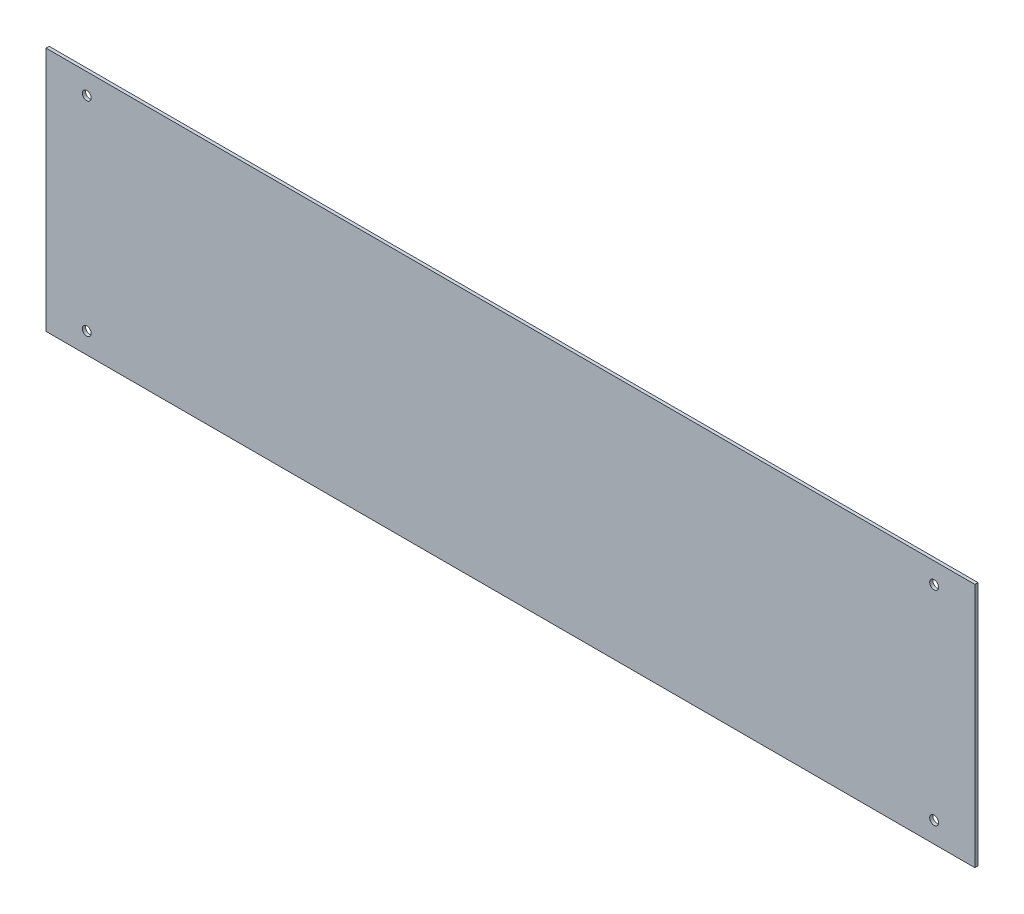
ISO-10303-21;
HEADER;
FILE_DESCRIPTION(('STEP AP214'),'2;1');
FILE_NAME('part.step','',(''),(''),'','','');
FILE_SCHEMA(('AUTOMOTIVE_DESIGN { 1 0 10303 214 1 1 1 1 }'));
ENDSEC;
DATA;
#1=APPLICATION_CONTEXT('core data for automotive mechanical design processes');
#2=APPLICATION_PROTOCOL_DEFINITION('international standard','automotive_design',2000,#1);
#3=PRODUCT_CONTEXT('',#1,'mechanical');
#4=PRODUCT('Part','Part','',(#3));
#5=PRODUCT_RELATED_PRODUCT_CATEGORY('part','',(#4));
#6=PRODUCT_DEFINITION_FORMATION('','',#4);
#7=PRODUCT_DEFINITION_CONTEXT('part definition',#1,'design');
#8=PRODUCT_DEFINITION('design','',#6,#7);
#9=PRODUCT_DEFINITION_SHAPE('','',#8);
#10=(LENGTH_UNIT() NAMED_UNIT(*) SI_UNIT(.MILLI.,.METRE.));
#11=(NAMED_UNIT(*) PLANE_ANGLE_UNIT() SI_UNIT($,.RADIAN.));
#12=(NAMED_UNIT(*) SI_UNIT($,.STERADIAN.) SOLID_ANGLE_UNIT());
#13=UNCERTAINTY_MEASURE_WITH_UNIT(LENGTH_MEASURE(1.E-05),#10,'distance_accuracy_value','');
#14=(GEOMETRIC_REPRESENTATION_CONTEXT(3) GLOBAL_UNCERTAINTY_ASSIGNED_CONTEXT((#13)) GLOBAL_UNIT_ASSIGNED_CONTEXT((#10,
#11,#12)) REPRESENTATION_CONTEXT('',''));
#15=CARTESIAN_POINT('',(0.,0.,0.));
#16=DIRECTION('',(0.,0.,1.));
#17=DIRECTION('',(1.,0.,0.));
#18=AXIS2_PLACEMENT_3D('',#15,#16,#17);
#19=CARTESIAN_POINT('',(0.,0.,1.5875));
#20=DIRECTION('',(0.,0.,1.));
#21=DIRECTION('',(1.,0.,0.));
#22=AXIS2_PLACEMENT_3D('',#19,#20,#21);
#23=PLANE('',#22);
#24=CARTESIAN_POINT('',(35.6965822730962,-290.725352817502,1.5875));
#25=DIRECTION('',(0.,0.,1.));
#26=DIRECTION('',(1.,0.,0.));
#27=AXIS2_PLACEMENT_3D('',#24,#25,#26);
#28=CIRCLE('',#27,2.24999999999999);
#29=CARTESIAN_POINT('',(37.9465822730962,-290.725352817502,1.5875));
#30=VERTEX_POINT('',#29);
#31=EDGE_CURVE('E133',#30,#30,#28,.T.);
#32=ORIENTED_EDGE('',*,*,#31,.F.);
#33=EDGE_LOOP('',(#32));
#34=FACE_BOUND('',#33,.T.);
#35=CARTESIAN_POINT('',(35.6965822730962,-394.083352817502,1.5875));
#36=DIRECTION('',(0.,0.,1.));
#37=DIRECTION('',(1.,0.,0.));
#38=AXIS2_PLACEMENT_3D('',#35,#36,#37);
#39=CIRCLE('',#38,2.24999999999999);
#40=CARTESIAN_POINT('',(37.9465822730962,-394.083352817502,1.5875));
#41=VERTEX_POINT('',#40);
#42=EDGE_CURVE('E127',#41,#41,#39,.T.);
#43=ORIENTED_EDGE('',*,*,#42,.F.);
#44=EDGE_LOOP('',(#43));
#45=FACE_BOUND('',#44,.T.);
#46=CARTESIAN_POINT('',(465.210582273096,-290.725352817502,1.5875));
#47=DIRECTION('',(0.,0.,1.));
#48=DIRECTION('',(1.,0.,0.));
#49=AXIS2_PLACEMENT_3D('',#46,#47,#48);
#50=CIRCLE('',#49,2.24999999999997);
#51=CARTESIAN_POINT('',(467.460582273096,-290.725352817502,1.5875));
#52=VERTEX_POINT('',#51);
#53=EDGE_CURVE('E121',#52,#52,#50,.T.);
#54=ORIENTED_EDGE('',*,*,#53,.F.);
#55=EDGE_LOOP('',(#54));
#56=FACE_BOUND('',#55,.T.);
#57=CARTESIAN_POINT('',(465.210582273096,-394.083352817502,1.5875));
#58=DIRECTION('',(0.,0.,1.));
#59=DIRECTION('',(1.,0.,0.));
#60=AXIS2_PLACEMENT_3D('',#57,#58,#59);
#61=CIRCLE('',#60,2.24999999999997);
#62=CARTESIAN_POINT('',(467.460582273096,-394.083352817502,1.5875));
#63=VERTEX_POINT('',#62);
#64=EDGE_CURVE('E115',#63,#63,#61,.T.);
#65=ORIENTED_EDGE('',*,*,#64,.F.);
#66=EDGE_LOOP('',(#65));
#67=FACE_BOUND('',#66,.T.);
#68=DIRECTION('',(0.,-1.,0.));
#69=VECTOR('',#68,1.);
#70=CARTESIAN_POINT('',(15.0365822731017,-280.215352817502,1.5875));
#71=LINE('',#70,#69);
#72=CARTESIAN_POINT('',(15.0365822731017,-280.215352817502,1.5875));
#73=VERTEX_POINT('',#72);
#74=CARTESIAN_POINT('',(15.0365822731017,-404.593352817502,1.5875));
#75=VERTEX_POINT('',#74);
#76=EDGE_CURVE('E87',#73,#75,#71,.T.);
#77=ORIENTED_EDGE('',*,*,#76,.T.);
#78=DIRECTION('',(1.,0.,0.));
#79=VECTOR('',#78,1.);
#80=CARTESIAN_POINT('',(15.0365822731017,-404.593352817502,1.5875));
#81=LINE('',#80,#79);
#82=CARTESIAN_POINT('',(485.870582273094,-404.593352817502,1.5875));
#83=VERTEX_POINT('',#82);
#84=EDGE_CURVE('E83',#75,#83,#81,.T.);
#85=ORIENTED_EDGE('',*,*,#84,.T.);
#86=DIRECTION('',(0.,1.,0.));
#87=VECTOR('',#86,1.);
#88=CARTESIAN_POINT('',(485.870582273094,-280.215352817502,1.5875));
#89=LINE('',#88,#87);
#90=CARTESIAN_POINT('',(485.870582273094,-280.215352817502,1.5875));
#91=VERTEX_POINT('',#90);
#92=EDGE_CURVE('E85',#83,#91,#89,.T.);
#93=ORIENTED_EDGE('',*,*,#92,.T.);
#94=DIRECTION('',(-1.,0.,0.));
#95=VECTOR('',#94,1.);
#96=CARTESIAN_POINT('',(15.0365822731017,-280.215352817502,1.5875));
#97=LINE('',#96,#95);
#98=EDGE_CURVE('E53',#91,#73,#97,.T.);
#99=ORIENTED_EDGE('',*,*,#98,.T.);
#100=EDGE_LOOP('',(#77,#85,#93,#99));
#101=FACE_BOUND('',#100,.T.);
#102=ADVANCED_FACE('F36',(#34,#45,#56,#67,#101),#23,.T.);
#103=CARTESIAN_POINT('',(0.,0.,0.));
#104=DIRECTION('',(0.,0.,1.));
#105=DIRECTION('',(1.,0.,0.));
#106=AXIS2_PLACEMENT_3D('',#103,#104,#105);
#107=PLANE('',#106);
#108=CARTESIAN_POINT('',(35.6965822730962,-290.725352817502,0.));
#109=DIRECTION('',(0.,0.,1.));
#110=DIRECTION('',(1.,0.,0.));
#111=AXIS2_PLACEMENT_3D('',#108,#109,#110);
#112=CIRCLE('',#111,2.25);
#113=CARTESIAN_POINT('',(37.9465822730962,-290.725352817502,0.));
#114=VERTEX_POINT('',#113);
#115=EDGE_CURVE('E130',#114,#114,#112,.T.);
#116=ORIENTED_EDGE('',*,*,#115,.T.);
#117=EDGE_LOOP('',(#116));
#118=FACE_BOUND('',#117,.T.);
#119=CARTESIAN_POINT('',(35.6965822730962,-394.083352817502,0.));
#120=DIRECTION('',(0.,0.,1.));
#121=DIRECTION('',(1.,0.,0.));
#122=AXIS2_PLACEMENT_3D('',#119,#120,#121);
#123=CIRCLE('',#122,2.25);
#124=CARTESIAN_POINT('',(37.9465822730962,-394.083352817502,0.));
#125=VERTEX_POINT('',#124);
#126=EDGE_CURVE('E124',#125,#125,#123,.T.);
#127=ORIENTED_EDGE('',*,*,#126,.T.);
#128=EDGE_LOOP('',(#127));
#129=FACE_BOUND('',#128,.T.);
#130=CARTESIAN_POINT('',(465.210582273096,-290.725352817502,0.));
#131=DIRECTION('',(0.,0.,1.));
#132=DIRECTION('',(1.,0.,0.));
#133=AXIS2_PLACEMENT_3D('',#130,#131,#132);
#134=CIRCLE('',#133,2.24999999999997);
#135=CARTESIAN_POINT('',(467.460582273096,-290.725352817502,0.));
#136=VERTEX_POINT('',#135);
#137=EDGE_CURVE('E118',#136,#136,#134,.T.);
#138=ORIENTED_EDGE('',*,*,#137,.T.);
#139=EDGE_LOOP('',(#138));
#140=FACE_BOUND('',#139,.T.);
#141=CARTESIAN_POINT('',(465.210582273096,-394.083352817502,0.));
#142=DIRECTION('',(0.,0.,1.));
#143=DIRECTION('',(1.,0.,0.));
#144=AXIS2_PLACEMENT_3D('',#141,#142,#143);
#145=CIRCLE('',#144,2.24999999999997);
#146=CARTESIAN_POINT('',(467.460582273096,-394.083352817502,0.));
#147=VERTEX_POINT('',#146);
#148=EDGE_CURVE('E102',#147,#147,#145,.T.);
#149=ORIENTED_EDGE('',*,*,#148,.T.);
#150=EDGE_LOOP('',(#149));
#151=FACE_BOUND('',#150,.T.);
#152=DIRECTION('',(0.,-1.,0.));
#153=VECTOR('',#152,1.);
#154=CARTESIAN_POINT('',(15.0365822731017,-280.215352817502,0.));
#155=LINE('',#154,#153);
#156=CARTESIAN_POINT('',(15.0365822731017,-280.215352817502,0.));
#157=VERTEX_POINT('',#156);
#158=CARTESIAN_POINT('',(15.0365822731017,-404.593352817502,0.));
#159=VERTEX_POINT('',#158);
#160=EDGE_CURVE('E99',#157,#159,#155,.T.);
#161=ORIENTED_EDGE('',*,*,#160,.F.);
#162=DIRECTION('',(-1.,0.,0.));
#163=VECTOR('',#162,1.);
#164=CARTESIAN_POINT('',(15.0365822731017,-280.215352817502,0.));
#165=LINE('',#164,#163);
#166=CARTESIAN_POINT('',(485.870582273094,-280.215352817502,0.));
#167=VERTEX_POINT('',#166);
#168=EDGE_CURVE('E76',#167,#157,#165,.T.);
#169=ORIENTED_EDGE('',*,*,#168,.F.);
#170=DIRECTION('',(0.,1.,0.));
#171=VECTOR('',#170,1.);
#172=CARTESIAN_POINT('',(485.870582273094,-280.215352817502,0.));
#173=LINE('',#172,#171);
#174=CARTESIAN_POINT('',(485.870582273094,-404.593352817502,0.));
#175=VERTEX_POINT('',#174);
#176=EDGE_CURVE('E70',#175,#167,#173,.T.);
#177=ORIENTED_EDGE('',*,*,#176,.F.);
#178=DIRECTION('',(1.,0.,0.));
#179=VECTOR('',#178,1.);
#180=CARTESIAN_POINT('',(15.0365822731017,-404.593352817502,0.));
#181=LINE('',#180,#179);
#182=EDGE_CURVE('E91',#159,#175,#181,.T.);
#183=ORIENTED_EDGE('',*,*,#182,.F.);
#184=EDGE_LOOP('',(#161,#169,#177,#183));
#185=FACE_BOUND('',#184,.T.);
#186=ADVANCED_FACE('F110',(#118,#129,#140,#151,#185),#107,.F.);
#187=CARTESIAN_POINT('',(15.0365822731017,-280.215352817502,1.5875));
#188=DIRECTION('',(1.,0.,0.));
#189=DIRECTION('',(0.,0.,-1.));
#190=AXIS2_PLACEMENT_3D('',#187,#188,#189);
#191=PLANE('',#190);
#192=ORIENTED_EDGE('',*,*,#160,.T.);
#193=DIRECTION('',(0.,0.,-1.));
#194=VECTOR('',#193,1.);
#195=CARTESIAN_POINT('',(15.0365822731017,-404.593352817502,1.5875));
#196=LINE('',#195,#194);
#197=EDGE_CURVE('E11',#75,#159,#196,.T.);
#198=ORIENTED_EDGE('',*,*,#197,.F.);
#199=ORIENTED_EDGE('',*,*,#76,.F.);
#200=DIRECTION('',(0.,0.,-1.));
#201=VECTOR('',#200,1.);
#202=CARTESIAN_POINT('',(15.0365822731017,-280.215352817502,1.5875));
#203=LINE('',#202,#201);
#204=EDGE_CURVE('E95',#73,#157,#203,.T.);
#205=ORIENTED_EDGE('',*,*,#204,.T.);
#206=EDGE_LOOP('',(#192,#198,#199,#205));
#207=FACE_BOUND('',#206,.T.);
#208=ADVANCED_FACE('F38',(#207),#191,.F.);
#209=CARTESIAN_POINT('',(15.0365822731017,-404.593352817502,1.5875));
#210=DIRECTION('',(0.,1.,0.));
#211=DIRECTION('',(0.,0.,1.));
#212=AXIS2_PLACEMENT_3D('',#209,#210,#211);
#213=PLANE('',#212);
#214=ORIENTED_EDGE('',*,*,#182,.T.);
#215=DIRECTION('',(0.,0.,-1.));
#216=VECTOR('',#215,1.);
#217=CARTESIAN_POINT('',(485.870582273094,-404.593352817502,1.5875));
#218=LINE('',#217,#216);
#219=EDGE_CURVE('E45',#83,#175,#218,.T.);
#220=ORIENTED_EDGE('',*,*,#219,.F.);
#221=ORIENTED_EDGE('',*,*,#84,.F.);
#222=ORIENTED_EDGE('',*,*,#197,.T.);
#223=EDGE_LOOP('',(#214,#220,#221,#222));
#224=FACE_BOUND('',#223,.T.);
#225=ADVANCED_FACE('F90',(#224),#213,.F.);
#226=CARTESIAN_POINT('',(485.870582273094,-280.215352817502,1.5875));
#227=DIRECTION('',(-1.,0.,0.));
#228=DIRECTION('',(0.,0.,1.));
#229=AXIS2_PLACEMENT_3D('',#226,#227,#228);
#230=PLANE('',#229);
#231=ORIENTED_EDGE('',*,*,#176,.T.);
#232=DIRECTION('',(0.,0.,-1.));
#233=VECTOR('',#232,1.);
#234=CARTESIAN_POINT('',(485.870582273094,-280.215352817502,1.5875));
#235=LINE('',#234,#233);
#236=EDGE_CURVE('E92',#91,#167,#235,.T.);
#237=ORIENTED_EDGE('',*,*,#236,.F.);
#238=ORIENTED_EDGE('',*,*,#92,.F.);
#239=ORIENTED_EDGE('',*,*,#219,.T.);
#240=EDGE_LOOP('',(#231,#237,#238,#239));
#241=FACE_BOUND('',#240,.T.);
#242=ADVANCED_FACE('F93',(#241),#230,.F.);
#243=CARTESIAN_POINT('',(15.0365822731017,-280.215352817502,1.5875));
#244=DIRECTION('',(0.,-1.,0.));
#245=DIRECTION('',(0.,0.,-1.));
#246=AXIS2_PLACEMENT_3D('',#243,#244,#245);
#247=PLANE('',#246);
#248=ORIENTED_EDGE('',*,*,#168,.T.);
#249=ORIENTED_EDGE('',*,*,#204,.F.);
#250=ORIENTED_EDGE('',*,*,#98,.F.);
#251=ORIENTED_EDGE('',*,*,#236,.T.);
#252=EDGE_LOOP('',(#248,#249,#250,#251));
#253=FACE_BOUND('',#252,.T.);
#254=ADVANCED_FACE('F107',(#253),#247,.F.);
#255=CARTESIAN_POINT('',(465.210582273096,-394.083352817502,1.5875));
#256=DIRECTION('',(0.,0.,1.));
#257=DIRECTION('',(1.,0.,0.));
#258=AXIS2_PLACEMENT_3D('',#255,#256,#257);
#259=CYLINDRICAL_SURFACE('',#258,2.24999999999997);
#260=ORIENTED_EDGE('',*,*,#148,.F.);
#261=EDGE_LOOP('',(#260));
#262=FACE_BOUND('',#261,.T.);
#263=ORIENTED_EDGE('',*,*,#64,.T.);
#264=EDGE_LOOP('',(#263));
#265=FACE_BOUND('',#264,.T.);
#266=ADVANCED_FACE('F148',(#262,#265),#259,.F.);
#267=CARTESIAN_POINT('',(465.210582273096,-290.725352817502,1.5875));
#268=DIRECTION('',(0.,0.,1.));
#269=DIRECTION('',(1.,0.,0.));
#270=AXIS2_PLACEMENT_3D('',#267,#268,#269);
#271=CYLINDRICAL_SURFACE('',#270,2.24999999999997);
#272=ORIENTED_EDGE('',*,*,#137,.F.);
#273=EDGE_LOOP('',(#272));
#274=FACE_BOUND('',#273,.T.);
#275=ORIENTED_EDGE('',*,*,#53,.T.);
#276=EDGE_LOOP('',(#275));
#277=FACE_BOUND('',#276,.T.);
#278=ADVANCED_FACE('F150',(#274,#277),#271,.F.);
#279=CARTESIAN_POINT('',(35.6965822730962,-394.083352817502,1.5875));
#280=DIRECTION('',(0.,0.,1.));
#281=DIRECTION('',(1.,0.,0.));
#282=AXIS2_PLACEMENT_3D('',#279,#280,#281);
#283=CYLINDRICAL_SURFACE('',#282,2.25);
#284=ORIENTED_EDGE('',*,*,#126,.F.);
#285=EDGE_LOOP('',(#284));
#286=FACE_BOUND('',#285,.T.);
#287=ORIENTED_EDGE('',*,*,#42,.T.);
#288=EDGE_LOOP('',(#287));
#289=FACE_BOUND('',#288,.T.);
#290=ADVANCED_FACE('F157',(#286,#289),#283,.F.);
#291=CARTESIAN_POINT('',(35.6965822730962,-290.725352817502,1.5875));
#292=DIRECTION('',(0.,0.,1.));
#293=DIRECTION('',(1.,0.,0.));
#294=AXIS2_PLACEMENT_3D('',#291,#292,#293);
#295=CYLINDRICAL_SURFACE('',#294,2.25);
#296=ORIENTED_EDGE('',*,*,#115,.F.);
#297=EDGE_LOOP('',(#296));
#298=FACE_BOUND('',#297,.T.);
#299=ORIENTED_EDGE('',*,*,#31,.T.);
#300=EDGE_LOOP('',(#299));
#301=FACE_BOUND('',#300,.T.);
#302=ADVANCED_FACE('F137',(#298,#301),#295,.F.);
#303=CLOSED_SHELL('',(#102,#186,#208,#225,#242,#254,#266,#278,#290,#302));
#304=MANIFOLD_SOLID_BREP('B2',#303);
#305=ADVANCED_BREP_SHAPE_REPRESENTATION('',(#18,#304),#14);
#306=SHAPE_DEFINITION_REPRESENTATION(#9,#305);
ENDSEC;
END-ISO-10303-21;
